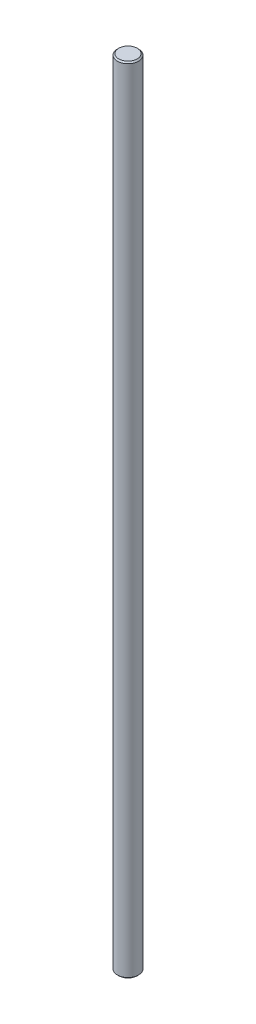
ISO-10303-21;
HEADER;
FILE_DESCRIPTION(('STEP AP214'),'2;1');
FILE_NAME('part.step','',(''),(''),'','','');
FILE_SCHEMA(('AUTOMOTIVE_DESIGN { 1 0 10303 214 1 1 1 1 }'));
ENDSEC;
DATA;
#1=APPLICATION_CONTEXT('core data for automotive mechanical design processes');
#2=APPLICATION_PROTOCOL_DEFINITION('international standard','automotive_design',2000,#1);
#3=PRODUCT_CONTEXT('',#1,'mechanical');
#4=PRODUCT('Part','Part','',(#3));
#5=PRODUCT_RELATED_PRODUCT_CATEGORY('part','',(#4));
#6=PRODUCT_DEFINITION_FORMATION('','',#4);
#7=PRODUCT_DEFINITION_CONTEXT('part definition',#1,'design');
#8=PRODUCT_DEFINITION('design','',#6,#7);
#9=PRODUCT_DEFINITION_SHAPE('','',#8);
#10=(LENGTH_UNIT() NAMED_UNIT(*) SI_UNIT(.MILLI.,.METRE.));
#11=(NAMED_UNIT(*) PLANE_ANGLE_UNIT() SI_UNIT($,.RADIAN.));
#12=(NAMED_UNIT(*) SI_UNIT($,.STERADIAN.) SOLID_ANGLE_UNIT());
#13=UNCERTAINTY_MEASURE_WITH_UNIT(LENGTH_MEASURE(1.E-05),#10,'distance_accuracy_value','');
#14=(GEOMETRIC_REPRESENTATION_CONTEXT(3) GLOBAL_UNCERTAINTY_ASSIGNED_CONTEXT((#13)) GLOBAL_UNIT_ASSIGNED_CONTEXT((#10,
#11,#12)) REPRESENTATION_CONTEXT('',''));
#15=CARTESIAN_POINT('',(0.,0.,0.));
#16=DIRECTION('',(0.,0.,1.));
#17=DIRECTION('',(1.,0.,0.));
#18=AXIS2_PLACEMENT_3D('',#15,#16,#17);
#19=CARTESIAN_POINT('',(0.,150.,0.));
#20=DIRECTION('',(0.,-1.,0.));
#21=DIRECTION('',(0.,0.,-1.));
#22=AXIS2_PLACEMENT_3D('',#19,#20,#21);
#23=CYLINDRICAL_SURFACE('',#22,4.);
#24=CARTESIAN_POINT('',(0.,-149.5,0.));
#25=DIRECTION('',(0.,1.,0.));
#26=DIRECTION('',(0.,0.,1.));
#27=AXIS2_PLACEMENT_3D('',#24,#25,#26);
#28=CIRCLE('',#27,4.);
#29=CARTESIAN_POINT('',(0.,-149.5,4.));
#30=VERTEX_POINT('',#29);
#31=EDGE_CURVE('E42',#30,#30,#28,.T.);
#32=ORIENTED_EDGE('',*,*,#31,.T.);
#33=EDGE_LOOP('',(#32));
#34=FACE_BOUND('',#33,.T.);
#35=CARTESIAN_POINT('',(0.,149.5,0.));
#36=DIRECTION('',(0.,1.,0.));
#37=DIRECTION('',(0.,0.,1.));
#38=AXIS2_PLACEMENT_3D('',#35,#36,#37);
#39=CIRCLE('',#38,4.);
#40=CARTESIAN_POINT('',(0.,149.5,4.));
#41=VERTEX_POINT('',#40);
#42=EDGE_CURVE('E46',#41,#41,#39,.F.);
#43=ORIENTED_EDGE('',*,*,#42,.T.);
#44=EDGE_LOOP('',(#43));
#45=FACE_BOUND('',#44,.T.);
#46=ADVANCED_FACE('F31',(#34,#45),#23,.T.);
#47=CARTESIAN_POINT('',(0.,150.,0.));
#48=DIRECTION('',(0.,1.,0.));
#49=DIRECTION('',(0.,0.,1.));
#50=AXIS2_PLACEMENT_3D('',#47,#48,#49);
#51=PLANE('',#50);
#52=CARTESIAN_POINT('',(0.,150.,0.));
#53=DIRECTION('',(0.,1.,0.));
#54=DIRECTION('',(0.,0.,1.));
#55=AXIS2_PLACEMENT_3D('',#52,#53,#54);
#56=CIRCLE('',#55,3.49999999999998);
#57=CARTESIAN_POINT('',(0.,150.,3.49999999999998));
#58=VERTEX_POINT('',#57);
#59=EDGE_CURVE('E10',#58,#58,#56,.T.);
#60=ORIENTED_EDGE('',*,*,#59,.T.);
#61=EDGE_LOOP('',(#60));
#62=FACE_BOUND('',#61,.T.);
#63=ADVANCED_FACE('F62',(#62),#51,.T.);
#64=CARTESIAN_POINT('',(0.,-150.,0.));
#65=DIRECTION('',(0.,1.,0.));
#66=DIRECTION('',(0.,0.,1.));
#67=AXIS2_PLACEMENT_3D('',#64,#65,#66);
#68=PLANE('',#67);
#69=CARTESIAN_POINT('',(0.,-150.,0.));
#70=DIRECTION('',(0.,1.,0.));
#71=DIRECTION('',(0.,0.,1.));
#72=AXIS2_PLACEMENT_3D('',#69,#70,#71);
#73=CIRCLE('',#72,3.49999999999998);
#74=CARTESIAN_POINT('',(0.,-150.,3.49999999999998));
#75=VERTEX_POINT('',#74);
#76=EDGE_CURVE('E38',#75,#75,#73,.F.);
#77=ORIENTED_EDGE('',*,*,#76,.T.);
#78=EDGE_LOOP('',(#77));
#79=FACE_BOUND('',#78,.T.);
#80=ADVANCED_FACE('F59',(#79),#68,.F.);
#81=CARTESIAN_POINT('',(0.,-149.5,0.));
#82=DIRECTION('',(0.,1.,0.));
#83=DIRECTION('',(0.,0.,1.));
#84=AXIS2_PLACEMENT_3D('',#81,#82,#83);
#85=CONICAL_SURFACE('',#84,4.,0.785398163397473);
#86=ORIENTED_EDGE('',*,*,#76,.F.);
#87=EDGE_LOOP('',(#86));
#88=FACE_BOUND('',#87,.T.);
#89=ORIENTED_EDGE('',*,*,#31,.F.);
#90=EDGE_LOOP('',(#89));
#91=FACE_BOUND('',#90,.T.);
#92=ADVANCED_FACE('F55',(#88,#91),#85,.T.);
#93=CARTESIAN_POINT('',(0.,150.,0.));
#94=DIRECTION('',(0.,-1.,0.));
#95=DIRECTION('',(0.,0.,-1.));
#96=AXIS2_PLACEMENT_3D('',#93,#94,#95);
#97=CONICAL_SURFACE('',#96,3.49999999999998,0.785398163397445);
#98=ORIENTED_EDGE('',*,*,#42,.F.);
#99=EDGE_LOOP('',(#98));
#100=FACE_BOUND('',#99,.T.);
#101=ORIENTED_EDGE('',*,*,#59,.F.);
#102=EDGE_LOOP('',(#101));
#103=FACE_BOUND('',#102,.T.);
#104=ADVANCED_FACE('F33',(#100,#103),#97,.T.);
#105=CLOSED_SHELL('',(#46,#63,#80,#92,#104));
#106=MANIFOLD_SOLID_BREP('B2',#105);
#107=ADVANCED_BREP_SHAPE_REPRESENTATION('',(#18,#106),#14);
#108=SHAPE_DEFINITION_REPRESENTATION(#9,#107);
ENDSEC;
END-ISO-10303-21;
